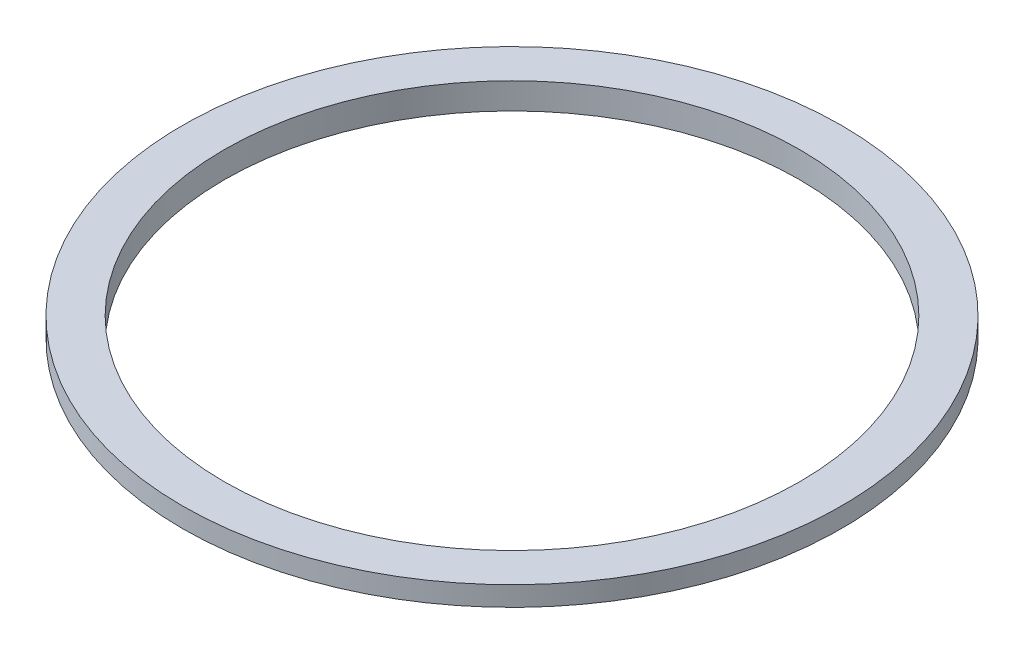
ISO-10303-21;
HEADER;
FILE_DESCRIPTION(('STEP AP214'),'2;1');
FILE_NAME('part.step','',(''),(''),'','','');
FILE_SCHEMA(('AUTOMOTIVE_DESIGN { 1 0 10303 214 1 1 1 1 }'));
ENDSEC;
DATA;
#1=APPLICATION_CONTEXT('core data for automotive mechanical design processes');
#2=APPLICATION_PROTOCOL_DEFINITION('international standard','automotive_design',2000,#1);
#3=PRODUCT_CONTEXT('',#1,'mechanical');
#4=PRODUCT('Part','Part','',(#3));
#5=PRODUCT_RELATED_PRODUCT_CATEGORY('part','',(#4));
#6=PRODUCT_DEFINITION_FORMATION('','',#4);
#7=PRODUCT_DEFINITION_CONTEXT('part definition',#1,'design');
#8=PRODUCT_DEFINITION('design','',#6,#7);
#9=PRODUCT_DEFINITION_SHAPE('','',#8);
#10=(LENGTH_UNIT() NAMED_UNIT(*) SI_UNIT(.MILLI.,.METRE.));
#11=(NAMED_UNIT(*) PLANE_ANGLE_UNIT() SI_UNIT($,.RADIAN.));
#12=(NAMED_UNIT(*) SI_UNIT($,.STERADIAN.) SOLID_ANGLE_UNIT());
#13=UNCERTAINTY_MEASURE_WITH_UNIT(LENGTH_MEASURE(1.E-05),#10,'distance_accuracy_value','');
#14=(GEOMETRIC_REPRESENTATION_CONTEXT(3) GLOBAL_UNCERTAINTY_ASSIGNED_CONTEXT((#13)) GLOBAL_UNIT_ASSIGNED_CONTEXT((#10,
#11,#12)) REPRESENTATION_CONTEXT('',''));
#15=CARTESIAN_POINT('',(0.,0.,0.));
#16=DIRECTION('',(0.,0.,1.));
#17=DIRECTION('',(1.,0.,0.));
#18=AXIS2_PLACEMENT_3D('',#15,#16,#17);
#19=CARTESIAN_POINT('',(0.,0.,0.));
#20=DIRECTION('',(0.,-1.,0.));
#21=DIRECTION('',(0.,0.,-1.));
#22=AXIS2_PLACEMENT_3D('',#19,#20,#21);
#23=CONICAL_SURFACE('',#22,32.1213203435596,0.785398163397446);
#24=CARTESIAN_POINT('',(0.,0.621320343559616,0.));
#25=DIRECTION('',(0.,-1.,0.));
#26=DIRECTION('',(0.,0.,-1.));
#27=AXIS2_PLACEMENT_3D('',#24,#25,#26);
#28=CIRCLE('',#27,31.5);
#29=CARTESIAN_POINT('',(0.,0.621320343559616,-31.5));
#30=VERTEX_POINT('',#29);
#31=EDGE_CURVE('E34',#30,#30,#28,.T.);
#32=ORIENTED_EDGE('',*,*,#31,.T.);
#33=EDGE_LOOP('',(#32));
#34=FACE_BOUND('',#33,.T.);
#35=CARTESIAN_POINT('',(0.,1.49632034355964,0.));
#36=DIRECTION('',(0.,-1.,0.));
#37=DIRECTION('',(0.,0.,-1.));
#38=AXIS2_PLACEMENT_3D('',#35,#36,#37);
#39=CIRCLE('',#38,30.625);
#40=CARTESIAN_POINT('',(0.,1.49632034355964,-30.625));
#41=VERTEX_POINT('',#40);
#42=EDGE_CURVE('E10',#41,#41,#39,.T.);
#43=ORIENTED_EDGE('',*,*,#42,.F.);
#44=EDGE_LOOP('',(#43));
#45=FACE_BOUND('',#44,.T.);
#46=ADVANCED_FACE('F31',(#34,#45),#23,.F.);
#47=CARTESIAN_POINT('',(0.,-28.6657349216588,0.));
#48=DIRECTION('',(0.,-1.,0.));
#49=DIRECTION('',(0.,0.,-1.));
#50=AXIS2_PLACEMENT_3D('',#47,#48,#49);
#51=CYLINDRICAL_SURFACE('',#50,30.625);
#52=CARTESIAN_POINT('',(0.,2.12132034355963,0.));
#53=DIRECTION('',(0.,-1.,0.));
#54=DIRECTION('',(0.,0.,-1.));
#55=AXIS2_PLACEMENT_3D('',#52,#53,#54);
#56=CIRCLE('',#55,30.625);
#57=CARTESIAN_POINT('',(0.,2.12132034355963,-30.625));
#58=VERTEX_POINT('',#57);
#59=EDGE_CURVE('E38',#58,#58,#56,.T.);
#60=ORIENTED_EDGE('',*,*,#59,.F.);
#61=EDGE_LOOP('',(#60));
#62=FACE_BOUND('',#61,.T.);
#63=ORIENTED_EDGE('',*,*,#42,.T.);
#64=EDGE_LOOP('',(#63));
#65=FACE_BOUND('',#64,.T.);
#66=ADVANCED_FACE('F88',(#62,#65),#51,.F.);
#67=CARTESIAN_POINT('',(29.375,2.12132034355963,0.));
#68=DIRECTION('',(0.,1.,0.));
#69=DIRECTION('',(0.,0.,1.));
#70=AXIS2_PLACEMENT_3D('',#67,#68,#69);
#71=PLANE('',#70);
#72=CARTESIAN_POINT('',(0.,2.12132034355963,0.));
#73=DIRECTION('',(0.,-1.,0.));
#74=DIRECTION('',(0.,0.,-1.));
#75=AXIS2_PLACEMENT_3D('',#72,#73,#74);
#76=CIRCLE('',#75,29.375);
#77=CARTESIAN_POINT('',(0.,2.12132034355963,-29.375));
#78=VERTEX_POINT('',#77);
#79=EDGE_CURVE('E42',#78,#78,#76,.T.);
#80=ORIENTED_EDGE('',*,*,#79,.F.);
#81=EDGE_LOOP('',(#80));
#82=FACE_BOUND('',#81,.T.);
#83=ORIENTED_EDGE('',*,*,#59,.T.);
#84=EDGE_LOOP('',(#83));
#85=FACE_BOUND('',#84,.T.);
#86=ADVANCED_FACE('F82',(#82,#85),#71,.F.);
#87=CARTESIAN_POINT('',(0.,-28.6657349216588,0.));
#88=DIRECTION('',(0.,-1.,0.));
#89=DIRECTION('',(0.,0.,-1.));
#90=AXIS2_PLACEMENT_3D('',#87,#88,#89);
#91=CYLINDRICAL_SURFACE('',#90,29.375);
#92=CARTESIAN_POINT('',(0.,1.49632034355963,0.));
#93=DIRECTION('',(0.,-1.,0.));
#94=DIRECTION('',(0.,0.,-1.));
#95=AXIS2_PLACEMENT_3D('',#92,#93,#94);
#96=CIRCLE('',#95,29.375);
#97=CARTESIAN_POINT('',(0.,1.49632034355963,-29.375));
#98=VERTEX_POINT('',#97);
#99=EDGE_CURVE('E47',#98,#98,#96,.T.);
#100=ORIENTED_EDGE('',*,*,#99,.F.);
#101=EDGE_LOOP('',(#100));
#102=FACE_BOUND('',#101,.T.);
#103=ORIENTED_EDGE('',*,*,#79,.T.);
#104=EDGE_LOOP('',(#103));
#105=FACE_BOUND('',#104,.T.);
#106=ADVANCED_FACE('F76',(#102,#105),#91,.T.);
#107=CARTESIAN_POINT('',(0.,1.49632034355963,0.));
#108=DIRECTION('',(0.,1.,0.));
#109=DIRECTION('',(0.,0.,1.));
#110=AXIS2_PLACEMENT_3D('',#107,#108,#109);
#111=CONICAL_SURFACE('',#110,29.375,0.785398163397445);
#112=CARTESIAN_POINT('',(0.,0.,0.));
#113=DIRECTION('',(0.,1.,0.));
#114=DIRECTION('',(0.,0.,1.));
#115=AXIS2_PLACEMENT_3D('',#112,#113,#114);
#116=CIRCLE('',#115,27.8786796564404);
#117=CARTESIAN_POINT('',(0.,0.,27.8786796564404));
#118=VERTEX_POINT('',#117);
#119=EDGE_CURVE('E53',#118,#118,#116,.T.);
#120=ORIENTED_EDGE('',*,*,#119,.T.);
#121=EDGE_LOOP('',(#120));
#122=FACE_BOUND('',#121,.T.);
#123=ORIENTED_EDGE('',*,*,#99,.T.);
#124=EDGE_LOOP('',(#123));
#125=FACE_BOUND('',#124,.T.);
#126=ADVANCED_FACE('F70',(#122,#125),#111,.T.);
#127=CARTESIAN_POINT('',(27.5,0.,0.));
#128=DIRECTION('',(0.,1.,0.));
#129=DIRECTION('',(0.,0.,1.));
#130=AXIS2_PLACEMENT_3D('',#127,#128,#129);
#131=PLANE('',#130);
#132=CARTESIAN_POINT('',(0.,0.,0.));
#133=DIRECTION('',(0.,-1.,0.));
#134=DIRECTION('',(0.,0.,-1.));
#135=AXIS2_PLACEMENT_3D('',#132,#133,#134);
#136=CIRCLE('',#135,27.5);
#137=CARTESIAN_POINT('',(0.,0.,-27.5));
#138=VERTEX_POINT('',#137);
#139=EDGE_CURVE('E59',#138,#138,#136,.T.);
#140=ORIENTED_EDGE('',*,*,#139,.F.);
#141=EDGE_LOOP('',(#140));
#142=FACE_BOUND('',#141,.T.);
#143=ORIENTED_EDGE('',*,*,#119,.F.);
#144=EDGE_LOOP('',(#143));
#145=FACE_BOUND('',#144,.T.);
#146=ADVANCED_FACE('F66',(#142,#145),#131,.F.);
#147=CARTESIAN_POINT('',(0.,0.,0.));
#148=DIRECTION('',(0.,-1.,0.));
#149=DIRECTION('',(0.,0.,-1.));
#150=AXIS2_PLACEMENT_3D('',#147,#148,#149);
#151=CYLINDRICAL_SURFACE('',#150,31.5);
#152=CARTESIAN_POINT('',(0.,2.5,0.));
#153=DIRECTION('',(0.,-1.,0.));
#154=DIRECTION('',(0.,0.,-1.));
#155=AXIS2_PLACEMENT_3D('',#152,#153,#154);
#156=CIRCLE('',#155,31.5);
#157=CARTESIAN_POINT('',(0.,2.5,-31.5));
#158=VERTEX_POINT('',#157);
#159=EDGE_CURVE('E56',#158,#158,#156,.T.);
#160=ORIENTED_EDGE('',*,*,#159,.T.);
#161=EDGE_LOOP('',(#160));
#162=FACE_BOUND('',#161,.T.);
#163=ORIENTED_EDGE('',*,*,#31,.F.);
#164=EDGE_LOOP('',(#163));
#165=FACE_BOUND('',#164,.T.);
#166=ADVANCED_FACE('F69',(#162,#165),#151,.T.);
#167=CARTESIAN_POINT('',(27.5,2.5,0.));
#168=DIRECTION('',(0.,1.,0.));
#169=DIRECTION('',(0.,0.,1.));
#170=AXIS2_PLACEMENT_3D('',#167,#168,#169);
#171=PLANE('',#170);
#172=CARTESIAN_POINT('',(0.,2.5,0.));
#173=DIRECTION('',(0.,-1.,0.));
#174=DIRECTION('',(0.,0.,-1.));
#175=AXIS2_PLACEMENT_3D('',#172,#173,#174);
#176=CIRCLE('',#175,27.5);
#177=CARTESIAN_POINT('',(0.,2.5,-27.5));
#178=VERTEX_POINT('',#177);
#179=EDGE_CURVE('E50',#178,#178,#176,.T.);
#180=ORIENTED_EDGE('',*,*,#179,.T.);
#181=EDGE_LOOP('',(#180));
#182=FACE_BOUND('',#181,.T.);
#183=ORIENTED_EDGE('',*,*,#159,.F.);
#184=EDGE_LOOP('',(#183));
#185=FACE_BOUND('',#184,.T.);
#186=ADVANCED_FACE('F100',(#182,#185),#171,.T.);
#187=CARTESIAN_POINT('',(0.,-28.6657349216588,0.));
#188=DIRECTION('',(0.,-1.,0.));
#189=DIRECTION('',(0.,0.,-1.));
#190=AXIS2_PLACEMENT_3D('',#187,#188,#189);
#191=CYLINDRICAL_SURFACE('',#190,27.5);
#192=ORIENTED_EDGE('',*,*,#139,.T.);
#193=EDGE_LOOP('',(#192));
#194=FACE_BOUND('',#193,.T.);
#195=ORIENTED_EDGE('',*,*,#179,.F.);
#196=EDGE_LOOP('',(#195));
#197=FACE_BOUND('',#196,.T.);
#198=ADVANCED_FACE('F63',(#194,#197),#191,.F.);
#199=CLOSED_SHELL('',(#46,#66,#86,#106,#126,#146,#166,#186,#198));
#200=MANIFOLD_SOLID_BREP('B2',#199);
#201=ADVANCED_BREP_SHAPE_REPRESENTATION('',(#18,#200),#14);
#202=SHAPE_DEFINITION_REPRESENTATION(#9,#201);
ENDSEC;
END-ISO-10303-21;
